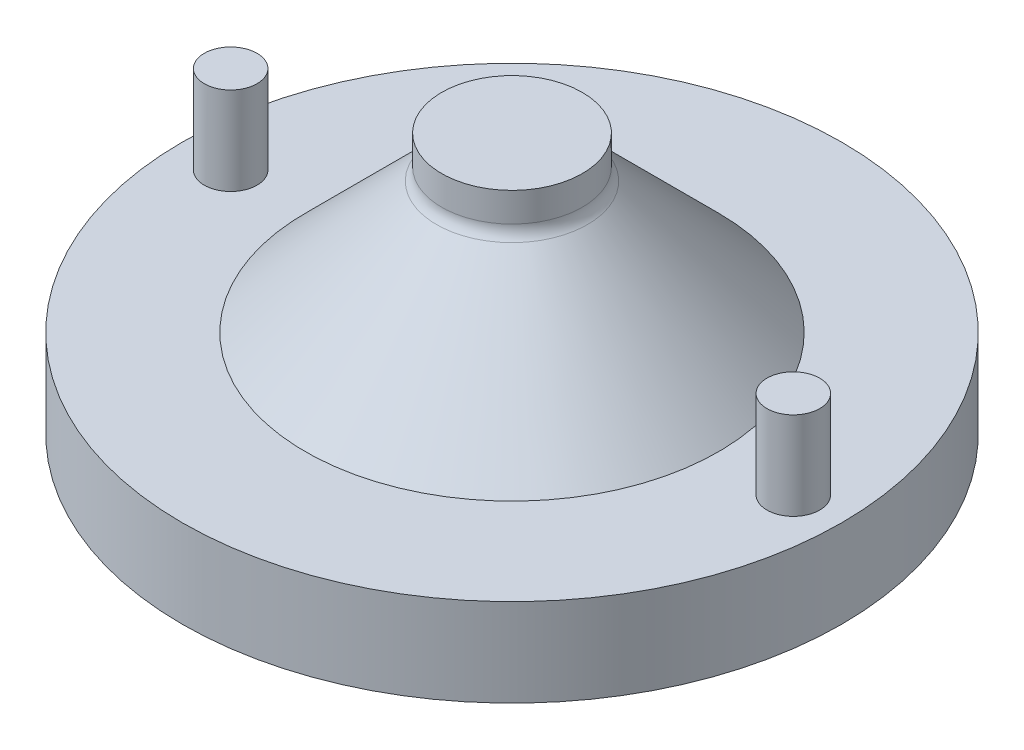
ISO-10303-21;
HEADER;
FILE_DESCRIPTION(('STEP AP214'),'2;1');
FILE_NAME('part.step','',(''),(''),'','','');
FILE_SCHEMA(('AUTOMOTIVE_DESIGN { 1 0 10303 214 1 1 1 1 }'));
ENDSEC;
DATA;
#1=APPLICATION_CONTEXT('core data for automotive mechanical design processes');
#2=APPLICATION_PROTOCOL_DEFINITION('international standard','automotive_design',2000,#1);
#3=PRODUCT_CONTEXT('',#1,'mechanical');
#4=PRODUCT('Part','Part','',(#3));
#5=PRODUCT_RELATED_PRODUCT_CATEGORY('part','',(#4));
#6=PRODUCT_DEFINITION_FORMATION('','',#4);
#7=PRODUCT_DEFINITION_CONTEXT('part definition',#1,'design');
#8=PRODUCT_DEFINITION('design','',#6,#7);
#9=PRODUCT_DEFINITION_SHAPE('','',#8);
#10=(LENGTH_UNIT() NAMED_UNIT(*) SI_UNIT(.MILLI.,.METRE.));
#11=(NAMED_UNIT(*) PLANE_ANGLE_UNIT() SI_UNIT($,.RADIAN.));
#12=(NAMED_UNIT(*) SI_UNIT($,.STERADIAN.) SOLID_ANGLE_UNIT());
#13=UNCERTAINTY_MEASURE_WITH_UNIT(LENGTH_MEASURE(1.E-05),#10,'distance_accuracy_value','');
#14=(GEOMETRIC_REPRESENTATION_CONTEXT(3) GLOBAL_UNCERTAINTY_ASSIGNED_CONTEXT((#13)) GLOBAL_UNIT_ASSIGNED_CONTEXT((#10,
#11,#12)) REPRESENTATION_CONTEXT('',''));
#15=CARTESIAN_POINT('',(0.,0.,0.));
#16=DIRECTION('',(0.,0.,1.));
#17=DIRECTION('',(1.,0.,0.));
#18=AXIS2_PLACEMENT_3D('',#15,#16,#17);
#19=CARTESIAN_POINT('',(0.,0.,0.));
#20=DIRECTION('',(0.,-1.,0.));
#21=DIRECTION('',(0.,0.,-1.));
#22=AXIS2_PLACEMENT_3D('',#19,#20,#21);
#23=CYLINDRICAL_SURFACE('',#22,18.75);
#24=CARTESIAN_POINT('',(0.,-13.0594211572139,0.));
#25=DIRECTION('',(0.,-1.,0.));
#26=DIRECTION('',(0.,0.,-1.));
#27=AXIS2_PLACEMENT_3D('',#24,#25,#26);
#28=CIRCLE('',#27,18.75);
#29=CARTESIAN_POINT('',(0.,-13.0594211572139,-18.75));
#30=VERTEX_POINT('',#29);
#31=EDGE_CURVE('E48',#30,#30,#28,.T.);
#32=ORIENTED_EDGE('',*,*,#31,.F.);
#33=EDGE_LOOP('',(#32));
#34=FACE_BOUND('',#33,.T.);
#35=CARTESIAN_POINT('',(0.,-8.05942115721387,0.));
#36=DIRECTION('',(0.,-1.,0.));
#37=DIRECTION('',(0.,0.,-1.));
#38=AXIS2_PLACEMENT_3D('',#35,#36,#37);
#39=CIRCLE('',#38,18.75);
#40=CARTESIAN_POINT('',(0.,-8.05942115721387,-18.75));
#41=VERTEX_POINT('',#40);
#42=EDGE_CURVE('E44',#41,#41,#39,.T.);
#43=ORIENTED_EDGE('',*,*,#42,.T.);
#44=EDGE_LOOP('',(#43));
#45=FACE_BOUND('',#44,.T.);
#46=ADVANCED_FACE('F34',(#34,#45),#23,.T.);
#47=CARTESIAN_POINT('',(-18.75,-13.0594211572139,0.));
#48=DIRECTION('',(0.,1.,0.));
#49=DIRECTION('',(0.,0.,1.));
#50=AXIS2_PLACEMENT_3D('',#47,#48,#49);
#51=PLANE('',#50);
#52=ORIENTED_EDGE('',*,*,#31,.T.);
#53=EDGE_LOOP('',(#52));
#54=FACE_BOUND('',#53,.T.);
#55=ADVANCED_FACE('F87',(#54),#51,.F.);
#56=CARTESIAN_POINT('',(-4.,1.76425186207766,0.));
#57=DIRECTION('',(0.,-1.,0.));
#58=DIRECTION('',(0.,0.,-1.));
#59=AXIS2_PLACEMENT_3D('',#56,#57,#58);
#60=PLANE('',#59);
#61=CARTESIAN_POINT('',(0.,1.76425186207766,0.));
#62=DIRECTION('',(0.,-1.,0.));
#63=DIRECTION('',(0.,0.,-1.));
#64=AXIS2_PLACEMENT_3D('',#61,#62,#63);
#65=CIRCLE('',#64,4.);
#66=CARTESIAN_POINT('',(0.,1.76425186207766,-4.));
#67=VERTEX_POINT('',#66);
#68=EDGE_CURVE('E53',#67,#67,#65,.T.);
#69=ORIENTED_EDGE('',*,*,#68,.F.);
#70=EDGE_LOOP('',(#69));
#71=FACE_BOUND('',#70,.T.);
#72=ADVANCED_FACE('F92',(#71),#60,.F.);
#73=CARTESIAN_POINT('',(0.,0.,0.));
#74=DIRECTION('',(0.,-1.,0.));
#75=DIRECTION('',(0.,0.,-1.));
#76=AXIS2_PLACEMENT_3D('',#73,#74,#75);
#77=CYLINDRICAL_SURFACE('',#76,4.);
#78=CARTESIAN_POINT('',(0.,0.104792405159199,0.));
#79=DIRECTION('',(0.,-1.,0.));
#80=DIRECTION('',(0.,0.,-1.));
#81=AXIS2_PLACEMENT_3D('',#78,#79,#80);
#82=CIRCLE('',#81,4.);
#83=CARTESIAN_POINT('',(0.,0.104792405159199,-4.));
#84=VERTEX_POINT('',#83);
#85=EDGE_CURVE('E56',#84,#84,#82,.T.);
#86=ORIENTED_EDGE('',*,*,#85,.F.);
#87=EDGE_LOOP('',(#86));
#88=FACE_BOUND('',#87,.T.);
#89=ORIENTED_EDGE('',*,*,#68,.T.);
#90=EDGE_LOOP('',(#89));
#91=FACE_BOUND('',#90,.T.);
#92=ADVANCED_FACE('F114',(#88,#91),#77,.T.);
#93=CARTESIAN_POINT('',(0.,0.104792405159199,0.));
#94=DIRECTION('',(0.,-1.,0.));
#95=DIRECTION('',(0.,0.,-1.));
#96=AXIS2_PLACEMENT_3D('',#93,#94,#95);
#97=TOROIDAL_SURFACE('',#96,5.,1.);
#98=CARTESIAN_POINT('',(0.,-0.602314376027348,0.));
#99=DIRECTION('',(0.,-1.,0.));
#100=DIRECTION('',(0.,0.,-1.));
#101=AXIS2_PLACEMENT_3D('',#98,#99,#100);
#102=CIRCLE('',#101,4.29289321881345);
#103=CARTESIAN_POINT('',(0.,-0.602314376027348,-4.29289321881345));
#104=VERTEX_POINT('',#103);
#105=EDGE_CURVE('E59',#104,#104,#102,.T.);
#106=ORIENTED_EDGE('',*,*,#105,.F.);
#107=EDGE_LOOP('',(#106));
#108=FACE_BOUND('',#107,.T.);
#109=ORIENTED_EDGE('',*,*,#85,.T.);
#110=EDGE_LOOP('',(#109));
#111=FACE_BOUND('',#110,.T.);
#112=ADVANCED_FACE('F108',(#108,#111),#97,.F.);
#113=CARTESIAN_POINT('',(0.,-0.602314376027348,0.));
#114=DIRECTION('',(0.,-1.,0.));
#115=DIRECTION('',(0.,0.,-1.));
#116=AXIS2_PLACEMENT_3D('',#113,#114,#115);
#117=CONICAL_SURFACE('',#116,4.29289321881345,0.78539816339745);
#118=CARTESIAN_POINT('',(0.,-8.05942115721387,0.));
#119=DIRECTION('',(0.,-1.,0.));
#120=DIRECTION('',(0.,0.,-1.));
#121=AXIS2_PLACEMENT_3D('',#118,#119,#120);
#122=CIRCLE('',#121,11.75);
#123=CARTESIAN_POINT('',(0.,-8.05942115721387,-11.75));
#124=VERTEX_POINT('',#123);
#125=EDGE_CURVE('E62',#124,#124,#122,.T.);
#126=ORIENTED_EDGE('',*,*,#125,.F.);
#127=EDGE_LOOP('',(#126));
#128=FACE_BOUND('',#127,.T.);
#129=ORIENTED_EDGE('',*,*,#105,.T.);
#130=EDGE_LOOP('',(#129));
#131=FACE_BOUND('',#130,.T.);
#132=ADVANCED_FACE('F101',(#128,#131),#117,.T.);
#133=CARTESIAN_POINT('',(-13.75,-8.05942115721387,0.));
#134=DIRECTION('',(0.,-1.,0.));
#135=DIRECTION('',(0.,0.,-1.));
#136=AXIS2_PLACEMENT_3D('',#133,#134,#135);
#137=PLANE('',#136);
#138=CARTESIAN_POINT('',(16.,-8.05942115721387,0.));
#139=DIRECTION('',(0.,-1.,0.));
#140=DIRECTION('',(0.,0.,-1.));
#141=AXIS2_PLACEMENT_3D('',#138,#139,#140);
#142=CIRCLE('',#141,1.5);
#143=CARTESIAN_POINT('',(16.,-8.05942115721387,-1.5));
#144=VERTEX_POINT('',#143);
#145=EDGE_CURVE('E10',#144,#144,#142,.F.);
#146=ORIENTED_EDGE('',*,*,#145,.F.);
#147=EDGE_LOOP('',(#146));
#148=FACE_BOUND('',#147,.T.);
#149=CARTESIAN_POINT('',(-16.,-8.05942115721387,0.));
#150=DIRECTION('',(0.,-1.,0.));
#151=DIRECTION('',(0.,0.,-1.));
#152=AXIS2_PLACEMENT_3D('',#149,#150,#151);
#153=CIRCLE('',#152,1.5);
#154=CARTESIAN_POINT('',(-16.,-8.05942115721387,-1.5));
#155=VERTEX_POINT('',#154);
#156=EDGE_CURVE('E40',#155,#155,#153,.F.);
#157=ORIENTED_EDGE('',*,*,#156,.F.);
#158=EDGE_LOOP('',(#157));
#159=FACE_BOUND('',#158,.T.);
#160=ORIENTED_EDGE('',*,*,#42,.F.);
#161=EDGE_LOOP('',(#160));
#162=FACE_BOUND('',#161,.T.);
#163=ORIENTED_EDGE('',*,*,#125,.T.);
#164=EDGE_LOOP('',(#163));
#165=FACE_BOUND('',#164,.T.);
#166=ADVANCED_FACE('F98',(#148,#159,#162,#165),#137,.F.);
#167=CARTESIAN_POINT('',(-16.,-3.05942115721387,0.));
#168=DIRECTION('',(0.,-1.,0.));
#169=DIRECTION('',(0.,0.,-1.));
#170=AXIS2_PLACEMENT_3D('',#167,#168,#169);
#171=CYLINDRICAL_SURFACE('',#170,1.5);
#172=CARTESIAN_POINT('',(-16.,-3.05942115721387,0.));
#173=DIRECTION('',(0.,1.,0.));
#174=DIRECTION('',(0.,0.,1.));
#175=AXIS2_PLACEMENT_3D('',#172,#173,#174);
#176=CIRCLE('',#175,1.5);
#177=CARTESIAN_POINT('',(-16.,-3.05942115721387,1.5));
#178=VERTEX_POINT('',#177);
#179=EDGE_CURVE('E65',#178,#178,#176,.T.);
#180=ORIENTED_EDGE('',*,*,#179,.F.);
#181=EDGE_LOOP('',(#180));
#182=FACE_BOUND('',#181,.T.);
#183=ORIENTED_EDGE('',*,*,#156,.T.);
#184=EDGE_LOOP('',(#183));
#185=FACE_BOUND('',#184,.T.);
#186=ADVANCED_FACE('F83',(#182,#185),#171,.T.);
#187=CARTESIAN_POINT('',(-16.,-3.05942115721387,0.));
#188=DIRECTION('',(0.,1.,0.));
#189=DIRECTION('',(0.,0.,1.));
#190=AXIS2_PLACEMENT_3D('',#187,#188,#189);
#191=PLANE('',#190);
#192=ORIENTED_EDGE('',*,*,#179,.T.);
#193=EDGE_LOOP('',(#192));
#194=FACE_BOUND('',#193,.T.);
#195=ADVANCED_FACE('F76',(#194),#191,.T.);
#196=CARTESIAN_POINT('',(16.,-3.05942115721387,0.));
#197=DIRECTION('',(0.,-1.,0.));
#198=DIRECTION('',(0.,0.,-1.));
#199=AXIS2_PLACEMENT_3D('',#196,#197,#198);
#200=CYLINDRICAL_SURFACE('',#199,1.5);
#201=CARTESIAN_POINT('',(16.,-3.05942115721387,0.));
#202=DIRECTION('',(0.,1.,0.));
#203=DIRECTION('',(0.,0.,-1.));
#204=AXIS2_PLACEMENT_3D('',#201,#202,#203);
#205=CIRCLE('',#204,1.5);
#206=CARTESIAN_POINT('',(16.,-3.05942115721387,-1.5));
#207=VERTEX_POINT('',#206);
#208=EDGE_CURVE('E68',#207,#207,#205,.T.);
#209=ORIENTED_EDGE('',*,*,#208,.F.);
#210=EDGE_LOOP('',(#209));
#211=FACE_BOUND('',#210,.T.);
#212=ORIENTED_EDGE('',*,*,#145,.T.);
#213=EDGE_LOOP('',(#212));
#214=FACE_BOUND('',#213,.T.);
#215=ADVANCED_FACE('F74',(#211,#214),#200,.T.);
#216=CARTESIAN_POINT('',(16.,-3.05942115721387,0.));
#217=DIRECTION('',(0.,-1.,0.));
#218=DIRECTION('',(0.,0.,-1.));
#219=AXIS2_PLACEMENT_3D('',#216,#217,#218);
#220=PLANE('',#219);
#221=ORIENTED_EDGE('',*,*,#208,.T.);
#222=EDGE_LOOP('',(#221));
#223=FACE_BOUND('',#222,.T.);
#224=ADVANCED_FACE('F72',(#223),#220,.F.);
#225=CLOSED_SHELL('',(#46,#55,#72,#92,#112,#132,#166,#186,#195,#215,#224));
#226=MANIFOLD_SOLID_BREP('B2',#225);
#227=ADVANCED_BREP_SHAPE_REPRESENTATION('',(#18,#226),#14);
#228=SHAPE_DEFINITION_REPRESENTATION(#9,#227);
ENDSEC;
END-ISO-10303-21;
